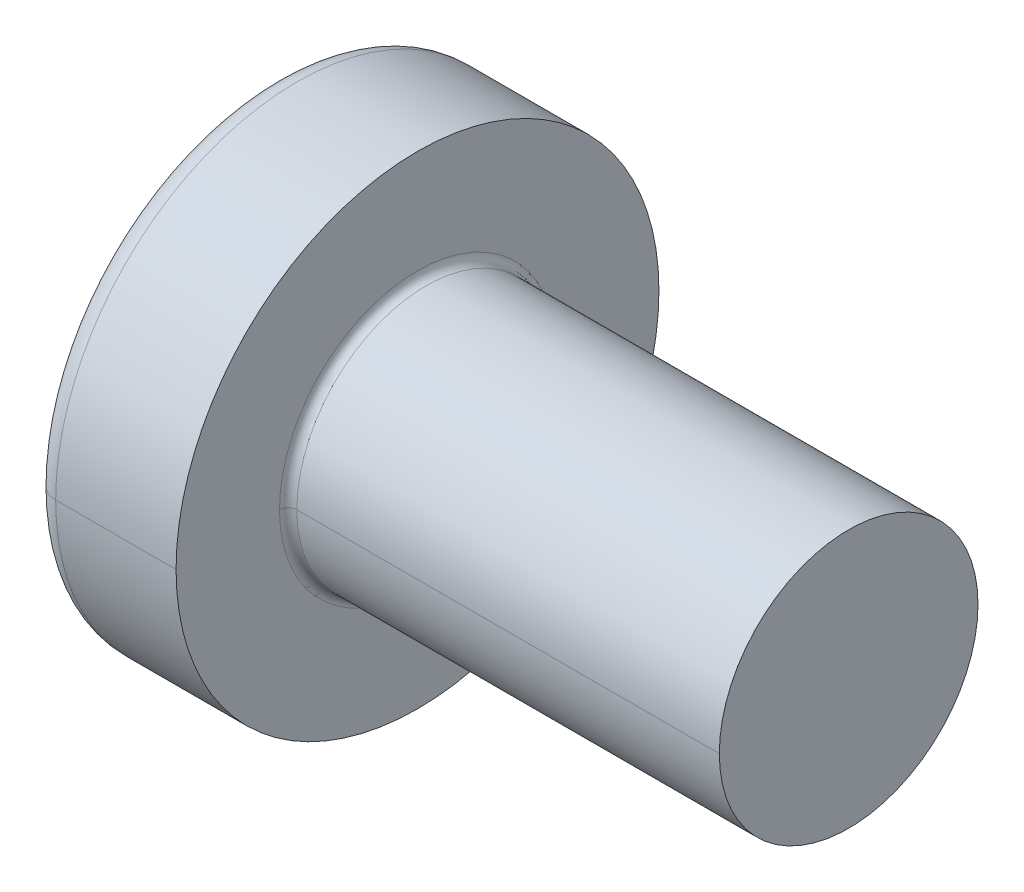
ISO-10303-21;
HEADER;
FILE_DESCRIPTION(('STEP AP214'),'2;1');
FILE_NAME('part.step','',(''),(''),'','','');
FILE_SCHEMA(('AUTOMOTIVE_DESIGN { 1 0 10303 214 1 1 1 1 }'));
ENDSEC;
DATA;
#1=APPLICATION_CONTEXT('core data for automotive mechanical design processes');
#2=APPLICATION_PROTOCOL_DEFINITION('international standard','automotive_design',2000,#1);
#3=PRODUCT_CONTEXT('',#1,'mechanical');
#4=PRODUCT('Part','Part','',(#3));
#5=PRODUCT_RELATED_PRODUCT_CATEGORY('part','',(#4));
#6=PRODUCT_DEFINITION_FORMATION('','',#4);
#7=PRODUCT_DEFINITION_CONTEXT('part definition',#1,'design');
#8=PRODUCT_DEFINITION('design','',#6,#7);
#9=PRODUCT_DEFINITION_SHAPE('','',#8);
#10=(LENGTH_UNIT() NAMED_UNIT(*) SI_UNIT(.MILLI.,.METRE.));
#11=(NAMED_UNIT(*) PLANE_ANGLE_UNIT() SI_UNIT($,.RADIAN.));
#12=(NAMED_UNIT(*) SI_UNIT($,.STERADIAN.) SOLID_ANGLE_UNIT());
#13=UNCERTAINTY_MEASURE_WITH_UNIT(LENGTH_MEASURE(1.E-05),#10,'distance_accuracy_value','');
#14=(GEOMETRIC_REPRESENTATION_CONTEXT(3) GLOBAL_UNCERTAINTY_ASSIGNED_CONTEXT((#13)) GLOBAL_UNIT_ASSIGNED_CONTEXT((#10,
#11,#12)) REPRESENTATION_CONTEXT('',''));
#15=CARTESIAN_POINT('',(0.,0.,0.));
#16=DIRECTION('',(0.,0.,1.));
#17=DIRECTION('',(1.,0.,0.));
#18=AXIS2_PLACEMENT_3D('',#15,#16,#17);
#19=CARTESIAN_POINT('',(1.75,0.,0.));
#20=DIRECTION('',(-1.,0.,0.));
#21=DIRECTION('',(0.,0.,1.));
#22=AXIS2_PLACEMENT_3D('',#19,#20,#21);
#23=CONICAL_SURFACE('',#22,0.556,0.0698131700797659);
#24=CARTESIAN_POINT('',(1.75,0.,0.));
#25=DIRECTION('',(-1.,0.,0.));
#26=DIRECTION('',(0.,0.,1.));
#27=AXIS2_PLACEMENT_3D('',#24,#25,#26);
#28=CIRCLE('',#27,0.556);
#29=CARTESIAN_POINT('',(1.75,0.37,0.415013252800521));
#30=VERTEX_POINT('',#29);
#31=CARTESIAN_POINT('',(1.75,0.415013252800438,0.37));
#32=VERTEX_POINT('',#31);
#33=EDGE_CURVE('E10',#30,#32,#28,.T.);
#34=ORIENTED_EDGE('',*,*,#33,.F.);
#35=CARTESIAN_POINT('',(0.0457951200896677,0.37,0.564760133041023));
#36=CARTESIAN_POINT('',(0.459714414560984,0.37,0.530157570950188));
#37=CARTESIAN_POINT('',(0.873562310752198,0.37,0.49466157398725));
#38=CARTESIAN_POINT('',(1.28725569682869,0.37,0.457455365426694));
#39=CARTESIAN_POINT('',(1.44152855585135,0.37,0.443580577090172));
#40=CARTESIAN_POINT('',(1.59577973725595,0.37,0.429460928792312));
#41=CARTESIAN_POINT('',(1.75,0.37,0.415013252800521));
#42=(BOUNDED_CURVE() B_SPLINE_CURVE(3,(#35,#36,#37,#38,#39,#40,#41),.UNSPECIFIED.,.F.,
.F.) B_SPLINE_CURVE_WITH_KNOTS((4,3,4),(1.86293707071727E-05,0.00126471872304593,
0.00172940316053664),
.UNSPECIFIED.) CURVE() GEOMETRIC_REPRESENTATION_ITEM() RATIONAL_B_SPLINE_CURVE((1.,1.,1.,1.,1.,
1.,1.)) REPRESENTATION_ITEM(''));
#43=CARTESIAN_POINT('',(0.0457951200896677,0.37,0.564760133041023));
#44=VERTEX_POINT('',#43);
#45=EDGE_CURVE('E239',#44,#30,#42,.T.);
#46=ORIENTED_EDGE('',*,*,#45,.F.);
#47=CARTESIAN_POINT('',(0.0457951200896418,0.,0.));
#48=DIRECTION('',(-1.,0.,0.));
#49=DIRECTION('',(0.,0.,-1.));
#50=AXIS2_PLACEMENT_3D('',#47,#48,#49);
#51=CIRCLE('',#50,0.675169614150692);
#52=CARTESIAN_POINT('',(0.0457951200896418,0.564760133040919,0.37));
#53=VERTEX_POINT('',#52);
#54=EDGE_CURVE('E253',#44,#53,#51,.T.);
#55=ORIENTED_EDGE('',*,*,#54,.T.);
#56=CARTESIAN_POINT('',(1.75,0.415013252800438,0.37));
#57=CARTESIAN_POINT('',(1.40508694476549,0.447325427470155,0.37));
#58=CARTESIAN_POINT('',(1.0600236419778,0.478042432000918,0.37));
#59=CARTESIAN_POINT('',(0.714889566385186,0.507901470296219,0.37));
#60=CARTESIAN_POINT('',(0.491887238581318,0.52719436403441,0.37));
#61=CARTESIAN_POINT('',(0.26885238485919,0.546113133596702,0.37));
#62=CARTESIAN_POINT('',(0.0457951200896418,0.564760133040919,0.37));
#63=(BOUNDED_CURVE() B_SPLINE_CURVE(3,(#56,#57,#58,#59,#60,#61,#62),.UNSPECIFIED.,.F.,
.F.) B_SPLINE_CURVE_WITH_KNOTS((4,3,4),(2.00874196653278E-07,0.00103947072881919,
0.00171097409518755),
.UNSPECIFIED.) CURVE() GEOMETRIC_REPRESENTATION_ITEM() RATIONAL_B_SPLINE_CURVE((1.,1.,1.,1.,1.,
1.,1.)) REPRESENTATION_ITEM(''));
#64=EDGE_CURVE('E267',#32,#53,#63,.T.);
#65=ORIENTED_EDGE('',*,*,#64,.F.);
#66=EDGE_LOOP('',(#34,#46,#55,#65));
#67=FACE_BOUND('',#66,.T.);
#68=ADVANCED_FACE('F15',(#67),#23,.F.);
#69=CARTESIAN_POINT('',(-998.069344648894,0.,0.));
#70=DIRECTION('',(-1.,0.,0.));
#71=DIRECTION('',(0.,0.,1.));
#72=AXIS2_PLACEMENT_3D('',#69,#70,#71);
#73=CONICAL_SURFACE('',#72,3077.68353717532,1.25663706143592);
#74=DIRECTION('',(-0.309016994374942,0.,-0.951056516295155));
#75=VECTOR('',#74,1.);
#76=CARTESIAN_POINT('',(1.93065535110549,0.,0.));
#77=LINE('',#76,#75);
#78=CARTESIAN_POINT('',(1.93065535110549,0.,0.));
#79=VERTEX_POINT('',#78);
#80=CARTESIAN_POINT('',(1.75,0.,-0.556));
#81=VERTEX_POINT('',#80);
#82=EDGE_CURVE('E390',#79,#81,#77,.T.);
#83=ORIENTED_EDGE('',*,*,#82,.F.);
#84=DIRECTION('',(-0.309016994374942,0.,0.951056516295155));
#85=VECTOR('',#84,1.);
#86=CARTESIAN_POINT('',(1.93065535110549,0.,0.));
#87=LINE('',#86,#85);
#88=CARTESIAN_POINT('',(1.75,0.,0.556));
#89=VERTEX_POINT('',#88);
#90=EDGE_CURVE('E386',#79,#89,#87,.T.);
#91=ORIENTED_EDGE('',*,*,#90,.T.);
#92=CARTESIAN_POINT('',(1.75,0.,0.));
#93=DIRECTION('',(-1.,0.,0.));
#94=DIRECTION('',(0.,0.,1.));
#95=AXIS2_PLACEMENT_3D('',#92,#93,#94);
#96=CIRCLE('',#95,0.556);
#97=EDGE_CURVE('E426',#89,#30,#96,.T.);
#98=ORIENTED_EDGE('',*,*,#97,.T.);
#99=ORIENTED_EDGE('',*,*,#33,.T.);
#100=CARTESIAN_POINT('',(1.75,0.,0.));
#101=DIRECTION('',(-1.,0.,0.));
#102=DIRECTION('',(0.,0.,1.));
#103=AXIS2_PLACEMENT_3D('',#100,#101,#102);
#104=CIRCLE('',#103,0.556);
#105=CARTESIAN_POINT('',(1.75,0.415013252800438,-0.37));
#106=VERTEX_POINT('',#105);
#107=EDGE_CURVE('E273',#32,#106,#104,.T.);
#108=ORIENTED_EDGE('',*,*,#107,.T.);
#109=CARTESIAN_POINT('',(1.75,0.,0.));
#110=DIRECTION('',(-1.,0.,0.));
#111=DIRECTION('',(0.,0.,1.));
#112=AXIS2_PLACEMENT_3D('',#109,#110,#111);
#113=CIRCLE('',#112,0.556);
#114=CARTESIAN_POINT('',(1.75,0.37,-0.415013252800436));
#115=VERTEX_POINT('',#114);
#116=EDGE_CURVE('E25',#106,#115,#113,.T.);
#117=ORIENTED_EDGE('',*,*,#116,.T.);
#118=CARTESIAN_POINT('',(1.75,0.,0.));
#119=DIRECTION('',(-1.,0.,0.));
#120=DIRECTION('',(0.,0.,1.));
#121=AXIS2_PLACEMENT_3D('',#118,#119,#120);
#122=CIRCLE('',#121,0.556);
#123=EDGE_CURVE('E343',#115,#81,#122,.T.);
#124=ORIENTED_EDGE('',*,*,#123,.T.);
#125=EDGE_LOOP('',(#83,#91,#98,#99,#108,#117,#124));
#126=FACE_BOUND('',#125,.T.);
#127=ADVANCED_FACE('F473',(#126),#73,.F.);
#128=CARTESIAN_POINT('',(1.75,0.,0.));
#129=DIRECTION('',(-1.,0.,0.));
#130=DIRECTION('',(0.,0.,1.));
#131=AXIS2_PLACEMENT_3D('',#128,#129,#130);
#132=CONICAL_SURFACE('',#131,0.556,0.0698131700797659);
#133=CARTESIAN_POINT('',(0.0457951200896418,0.,0.));
#134=DIRECTION('',(-1.,0.,0.));
#135=DIRECTION('',(0.,0.,-1.));
#136=AXIS2_PLACEMENT_3D('',#133,#134,#135);
#137=CIRCLE('',#136,0.675169614150692);
#138=CARTESIAN_POINT('',(0.0457951200896418,-0.564760133040919,0.37));
#139=VERTEX_POINT('',#138);
#140=CARTESIAN_POINT('',(0.0457951200896677,-0.37,0.56476013304102));
#141=VERTEX_POINT('',#140);
#142=EDGE_CURVE('E362',#139,#141,#137,.T.);
#143=ORIENTED_EDGE('',*,*,#142,.T.);
#144=CARTESIAN_POINT('',(1.75,-0.37,0.415013252800436));
#145=CARTESIAN_POINT('',(1.40508694476549,-0.37,0.447325427470153));
#146=CARTESIAN_POINT('',(1.0600236419778,-0.37,0.478042432000917));
#147=CARTESIAN_POINT('',(0.714889566385186,-0.37,0.507901470296218));
#148=CARTESIAN_POINT('',(0.491887238581318,-0.37,0.527194364034409));
#149=CARTESIAN_POINT('',(0.26885238485919,-0.37,0.546113133596701));
#150=CARTESIAN_POINT('',(0.0457951200896677,-0.37,0.56476013304102));
#151=(BOUNDED_CURVE() B_SPLINE_CURVE(3,(#144,#145,#146,#147,#148,#149,#150),.UNSPECIFIED.,.F.,
.F.) B_SPLINE_CURVE_WITH_KNOTS((4,3,4),(2.00874196653249E-07,0.00103947072881919,
0.00171097409518755),
.UNSPECIFIED.) CURVE() GEOMETRIC_REPRESENTATION_ITEM() RATIONAL_B_SPLINE_CURVE((1.,1.,1.,1.,1.,
1.,1.)) REPRESENTATION_ITEM(''));
#152=CARTESIAN_POINT('',(1.75,-0.37,0.415013252800436));
#153=VERTEX_POINT('',#152);
#154=EDGE_CURVE('E297',#153,#141,#151,.T.);
#155=ORIENTED_EDGE('',*,*,#154,.F.);
#156=CARTESIAN_POINT('',(1.75,0.,0.));
#157=DIRECTION('',(-1.,0.,0.));
#158=DIRECTION('',(0.,0.,1.));
#159=AXIS2_PLACEMENT_3D('',#156,#157,#158);
#160=CIRCLE('',#159,0.556);
#161=CARTESIAN_POINT('',(1.75,-0.415013252800438,0.37));
#162=VERTEX_POINT('',#161);
#163=EDGE_CURVE('E335',#162,#153,#160,.T.);
#164=ORIENTED_EDGE('',*,*,#163,.F.);
#165=CARTESIAN_POINT('',(0.0457951200896418,-0.564760133040919,0.37));
#166=CARTESIAN_POINT('',(0.459714414560985,-0.530157570950187,0.37));
#167=CARTESIAN_POINT('',(0.873562310752198,-0.494661573987248,0.37));
#168=CARTESIAN_POINT('',(1.28725569682869,-0.457455365426693,0.37));
#169=CARTESIAN_POINT('',(1.44152855585135,-0.443580577090171,0.37));
#170=CARTESIAN_POINT('',(1.59577973725595,-0.429460928792311,0.37));
#171=CARTESIAN_POINT('',(1.75,-0.415013252800438,0.37));
#172=(BOUNDED_CURVE() B_SPLINE_CURVE(3,(#165,#166,#167,#168,#169,#170,#171),.UNSPECIFIED.,.F.,
.F.) B_SPLINE_CURVE_WITH_KNOTS((4,3,4),(1.86293707071732E-05,0.00126471872304593,
0.00172940316053664),
.UNSPECIFIED.) CURVE() GEOMETRIC_REPRESENTATION_ITEM() RATIONAL_B_SPLINE_CURVE((1.,1.,1.,1.,1.,
1.,1.)) REPRESENTATION_ITEM(''));
#173=EDGE_CURVE('E417',#139,#162,#172,.T.);
#174=ORIENTED_EDGE('',*,*,#173,.F.);
#175=EDGE_LOOP('',(#143,#155,#164,#174));
#176=FACE_BOUND('',#175,.T.);
#177=ADVANCED_FACE('F856',(#176),#132,.F.);
#178=CARTESIAN_POINT('',(1.75,0.,0.));
#179=DIRECTION('',(-1.,0.,0.));
#180=DIRECTION('',(0.,0.,1.));
#181=AXIS2_PLACEMENT_3D('',#178,#179,#180);
#182=CONICAL_SURFACE('',#181,0.556,0.0698131700797659);
#183=CARTESIAN_POINT('',(0.0457951200896418,0.,0.));
#184=DIRECTION('',(-1.,0.,0.));
#185=DIRECTION('',(0.,0.,-1.));
#186=AXIS2_PLACEMENT_3D('',#183,#184,#185);
#187=CIRCLE('',#186,0.675169614150692);
#188=CARTESIAN_POINT('',(0.0457951200896418,0.564760133040919,-0.37));
#189=VERTEX_POINT('',#188);
#190=CARTESIAN_POINT('',(0.0457951200896677,0.37,-0.564760133041021));
#191=VERTEX_POINT('',#190);
#192=EDGE_CURVE('E320',#189,#191,#187,.T.);
#193=ORIENTED_EDGE('',*,*,#192,.T.);
#194=CARTESIAN_POINT('',(1.75,0.37,-0.415013252800436));
#195=CARTESIAN_POINT('',(1.40508694476549,0.37,-0.447325427470153));
#196=CARTESIAN_POINT('',(1.0600236419778,0.37,-0.478042432000917));
#197=CARTESIAN_POINT('',(0.714889566385186,0.37,-0.507901470296218));
#198=CARTESIAN_POINT('',(0.491887238581318,0.37,-0.527194364034409));
#199=CARTESIAN_POINT('',(0.26885238485919,0.37,-0.546113133596701));
#200=CARTESIAN_POINT('',(0.0457951200896677,0.37,-0.564760133041021));
#201=(BOUNDED_CURVE() B_SPLINE_CURVE(3,(#194,#195,#196,#197,#198,#199,#200),.UNSPECIFIED.,.F.,
.F.) B_SPLINE_CURVE_WITH_KNOTS((4,3,4),(2.00874196653293E-07,0.00103947072881919,
0.00171097409518755),
.UNSPECIFIED.) CURVE() GEOMETRIC_REPRESENTATION_ITEM() RATIONAL_B_SPLINE_CURVE((1.,1.,1.,1.,1.,
1.,1.)) REPRESENTATION_ITEM(''));
#202=EDGE_CURVE('E367',#115,#191,#201,.T.);
#203=ORIENTED_EDGE('',*,*,#202,.F.);
#204=ORIENTED_EDGE('',*,*,#116,.F.);
#205=CARTESIAN_POINT('',(0.0457951200896418,0.564760133040919,-0.37));
#206=CARTESIAN_POINT('',(0.459714414560985,0.530157570950187,-0.37));
#207=CARTESIAN_POINT('',(0.873562310752198,0.494661573987248,-0.37));
#208=CARTESIAN_POINT('',(1.28725569682869,0.457455365426693,-0.37));
#209=CARTESIAN_POINT('',(1.44152855585135,0.443580577090172,-0.37));
#210=CARTESIAN_POINT('',(1.59577973725595,0.429460928792311,-0.37));
#211=CARTESIAN_POINT('',(1.75,0.415013252800438,-0.37));
#212=(BOUNDED_CURVE() B_SPLINE_CURVE(3,(#205,#206,#207,#208,#209,#210,#211),.UNSPECIFIED.,.F.,
.F.) B_SPLINE_CURVE_WITH_KNOTS((4,3,4),(1.86293707071732E-05,0.00126471872304593,
0.00172940316053664),
.UNSPECIFIED.) CURVE() GEOMETRIC_REPRESENTATION_ITEM() RATIONAL_B_SPLINE_CURVE((1.,1.,1.,1.,1.,
1.,1.)) REPRESENTATION_ITEM(''));
#213=EDGE_CURVE('E292',#189,#106,#212,.T.);
#214=ORIENTED_EDGE('',*,*,#213,.F.);
#215=EDGE_LOOP('',(#193,#203,#204,#214));
#216=FACE_BOUND('',#215,.T.);
#217=ADVANCED_FACE('F860',(#216),#182,.F.);
#218=CARTESIAN_POINT('',(1.75,0.,0.));
#219=DIRECTION('',(-1.,0.,0.));
#220=DIRECTION('',(0.,0.,1.));
#221=AXIS2_PLACEMENT_3D('',#218,#219,#220);
#222=CONICAL_SURFACE('',#221,0.556,0.0698131700797659);
#223=CARTESIAN_POINT('',(1.75,0.,0.));
#224=DIRECTION('',(-1.,0.,0.));
#225=DIRECTION('',(0.,0.,1.));
#226=AXIS2_PLACEMENT_3D('',#223,#224,#225);
#227=CIRCLE('',#226,0.556);
#228=CARTESIAN_POINT('',(1.75,-0.37,-0.415013252800439));
#229=VERTEX_POINT('',#228);
#230=CARTESIAN_POINT('',(1.75,-0.415013252800438,-0.37));
#231=VERTEX_POINT('',#230);
#232=EDGE_CURVE('E281',#229,#231,#227,.T.);
#233=ORIENTED_EDGE('',*,*,#232,.F.);
#234=CARTESIAN_POINT('',(0.0457951200896677,-0.37,-0.564760133041023));
#235=CARTESIAN_POINT('',(0.459714414560984,-0.37,-0.530157570950188));
#236=CARTESIAN_POINT('',(0.873562310752198,-0.37,-0.494661573987249));
#237=CARTESIAN_POINT('',(1.28725569682869,-0.37,-0.457455365426694));
#238=CARTESIAN_POINT('',(1.44152855585135,-0.37,-0.443580577090172));
#239=CARTESIAN_POINT('',(1.59577973725595,-0.37,-0.429460928792312));
#240=CARTESIAN_POINT('',(1.75,-0.37,-0.415013252800439));
#241=(BOUNDED_CURVE() B_SPLINE_CURVE(3,(#234,#235,#236,#237,#238,#239,#240),.UNSPECIFIED.,.F.,
.F.) B_SPLINE_CURVE_WITH_KNOTS((4,3,4),(1.86293707071727E-05,0.00126471872304593,
0.00172940316053664),
.UNSPECIFIED.) CURVE() GEOMETRIC_REPRESENTATION_ITEM() RATIONAL_B_SPLINE_CURVE((1.,1.,1.,1.,1.,
1.,1.)) REPRESENTATION_ITEM(''));
#242=CARTESIAN_POINT('',(0.0457951200896677,-0.37,-0.564760133041023));
#243=VERTEX_POINT('',#242);
#244=EDGE_CURVE('E488',#243,#229,#241,.T.);
#245=ORIENTED_EDGE('',*,*,#244,.F.);
#246=CARTESIAN_POINT('',(0.0457951200896418,0.,0.));
#247=DIRECTION('',(-1.,0.,0.));
#248=DIRECTION('',(0.,0.,-1.));
#249=AXIS2_PLACEMENT_3D('',#246,#247,#248);
#250=CIRCLE('',#249,0.675169614150692);
#251=CARTESIAN_POINT('',(0.0457951200896418,-0.564760133040919,-0.37));
#252=VERTEX_POINT('',#251);
#253=EDGE_CURVE('E412',#243,#252,#250,.T.);
#254=ORIENTED_EDGE('',*,*,#253,.T.);
#255=CARTESIAN_POINT('',(1.75,-0.415013252800438,-0.37));
#256=CARTESIAN_POINT('',(1.40508694476549,-0.447325427470155,-0.37));
#257=CARTESIAN_POINT('',(1.0600236419778,-0.478042432000918,-0.37));
#258=CARTESIAN_POINT('',(0.714889566385186,-0.507901470296219,-0.37));
#259=CARTESIAN_POINT('',(0.491887238581318,-0.52719436403441,-0.37));
#260=CARTESIAN_POINT('',(0.268852384859189,-0.546113133596703,-0.37));
#261=CARTESIAN_POINT('',(0.0457951200896418,-0.564760133040919,-0.37));
#262=(BOUNDED_CURVE() B_SPLINE_CURVE(3,(#255,#256,#257,#258,#259,#260,#261),.UNSPECIFIED.,.F.,
.F.) B_SPLINE_CURVE_WITH_KNOTS((4,3,4),(2.00874196653278E-07,0.00103947072881919,
0.00171097409518755),
.UNSPECIFIED.) CURVE() GEOMETRIC_REPRESENTATION_ITEM() RATIONAL_B_SPLINE_CURVE((1.,1.,1.,1.,1.,
1.,1.)) REPRESENTATION_ITEM(''));
#263=EDGE_CURVE('E490',#231,#252,#262,.T.);
#264=ORIENTED_EDGE('',*,*,#263,.F.);
#265=EDGE_LOOP('',(#233,#245,#254,#264));
#266=FACE_BOUND('',#265,.T.);
#267=ADVANCED_FACE('F487',(#266),#222,.F.);
#268=CARTESIAN_POINT('',(1.75,-0.37,0.602));
#269=DIRECTION('',(-0.414899470250718,0.,-0.90986725932175));
#270=DIRECTION('',(-0.90986725932175,0.,0.414899470250718));
#271=AXIS2_PLACEMENT_3D('',#268,#269,#270);
#272=PLANE('',#271);
#273=CARTESIAN_POINT('',(4.66779696937586,0.,-0.728515418035393));
#274=DIRECTION('',(-0.414899470250718,0.,-0.90986725932175));
#275=DIRECTION('',(-0.90986725932175,0.,0.414899470250718));
#276=AXIS2_PLACEMENT_3D('',#273,#274,#275);
#277=CIRCLE('',#276,4.93547428644187);
#278=CARTESIAN_POINT('',(0.18980721879399,-0.370000000000005,1.31344790822994));
#279=VERTEX_POINT('',#278);
#280=CARTESIAN_POINT('',(0.189807218793991,0.369999999999995,1.31344790822994));
#281=VERTEX_POINT('',#280);
#282=EDGE_CURVE('E242',#279,#281,#277,.T.);
#283=ORIENTED_EDGE('',*,*,#282,.T.);
#284=DIRECTION('',(0.90986725932175,0.,-0.414899470250718));
#285=VECTOR('',#284,1.);
#286=CARTESIAN_POINT('',(0.,0.369999999999995,1.4));
#287=LINE('',#286,#285);
#288=CARTESIAN_POINT('',(1.75,0.37,0.602));
#289=VERTEX_POINT('',#288);
#290=EDGE_CURVE('E226',#281,#289,#287,.T.);
#291=ORIENTED_EDGE('',*,*,#290,.T.);
#292=DIRECTION('',(0.,-1.,0.));
#293=VECTOR('',#292,1.);
#294=CARTESIAN_POINT('',(1.75,-0.37,0.602));
#295=LINE('',#294,#293);
#296=CARTESIAN_POINT('',(1.75,-0.37,0.602));
#297=VERTEX_POINT('',#296);
#298=EDGE_CURVE('E425',#289,#297,#295,.T.);
#299=ORIENTED_EDGE('',*,*,#298,.T.);
#300=DIRECTION('',(0.90986725932175,0.,-0.414899470250718));
#301=VECTOR('',#300,1.);
#302=CARTESIAN_POINT('',(0.,-0.370000000000005,1.4));
#303=LINE('',#302,#301);
#304=EDGE_CURVE('E40',#279,#297,#303,.T.);
#305=ORIENTED_EDGE('',*,*,#304,.F.);
#306=EDGE_LOOP('',(#283,#291,#299,#305));
#307=FACE_BOUND('',#306,.T.);
#308=ADVANCED_FACE('F243',(#307),#272,.T.);
#309=CARTESIAN_POINT('',(1.75,0.37,-0.602));
#310=DIRECTION('',(-0.414899470250718,0.,0.90986725932175));
#311=DIRECTION('',(0.,1.,0.));
#312=AXIS2_PLACEMENT_3D('',#309,#310,#311);
#313=PLANE('',#312);
#314=CARTESIAN_POINT('',(4.66779696937586,0.,0.728515418035393));
#315=DIRECTION('',(-0.414899470250718,0.,0.90986725932175));
#316=DIRECTION('',(0.90986725932175,0.,0.414899470250718));
#317=AXIS2_PLACEMENT_3D('',#314,#315,#316);
#318=CIRCLE('',#317,4.93547428644187);
#319=CARTESIAN_POINT('',(0.189807218793991,0.370000000000005,-1.31344790822994));
#320=VERTEX_POINT('',#319);
#321=CARTESIAN_POINT('',(0.189807218793991,-0.369999999999995,-1.31344790822994));
#322=VERTEX_POINT('',#321);
#323=EDGE_CURVE('E321',#320,#322,#318,.T.);
#324=ORIENTED_EDGE('',*,*,#323,.T.);
#325=DIRECTION('',(0.90986725932175,0.,0.414899470250718));
#326=VECTOR('',#325,1.);
#327=CARTESIAN_POINT('',(0.,-0.369999999999995,-1.4));
#328=LINE('',#327,#326);
#329=CARTESIAN_POINT('',(1.75,-0.37,-0.602));
#330=VERTEX_POINT('',#329);
#331=EDGE_CURVE('E372',#322,#330,#328,.T.);
#332=ORIENTED_EDGE('',*,*,#331,.T.);
#333=DIRECTION('',(0.,1.,0.));
#334=VECTOR('',#333,1.);
#335=CARTESIAN_POINT('',(1.75,-0.37,-0.602));
#336=LINE('',#335,#334);
#337=CARTESIAN_POINT('',(1.75,0.37,-0.602));
#338=VERTEX_POINT('',#337);
#339=EDGE_CURVE('E18',#330,#338,#336,.T.);
#340=ORIENTED_EDGE('',*,*,#339,.T.);
#341=DIRECTION('',(0.90986725932175,0.,0.414899470250718));
#342=VECTOR('',#341,1.);
#343=CARTESIAN_POINT('',(0.,0.370000000000005,-1.4));
#344=LINE('',#343,#342);
#345=EDGE_CURVE('E302',#320,#338,#344,.T.);
#346=ORIENTED_EDGE('',*,*,#345,.F.);
#347=EDGE_LOOP('',(#324,#332,#340,#346));
#348=FACE_BOUND('',#347,.T.);
#349=ADVANCED_FACE('F922',(#348),#313,.T.);
#350=CARTESIAN_POINT('',(1.75,0.602,0.37));
#351=DIRECTION('',(-0.414899470250718,-0.90986725932175,0.));
#352=DIRECTION('',(-0.90986725932175,0.414899470250718,0.));
#353=AXIS2_PLACEMENT_3D('',#350,#351,#352);
#354=PLANE('',#353);
#355=CARTESIAN_POINT('',(4.66779696937586,-0.728515418035393,0.));
#356=DIRECTION('',(-0.414899470250718,-0.90986725932175,0.));
#357=DIRECTION('',(0.90986725932175,-0.414899470250718,0.));
#358=AXIS2_PLACEMENT_3D('',#355,#356,#357);
#359=CIRCLE('',#358,4.93547428644187);
#360=CARTESIAN_POINT('',(0.18980721879399,1.31344790822994,0.37));
#361=VERTEX_POINT('',#360);
#362=CARTESIAN_POINT('',(0.177170506918026,1.31921024884538,0.));
#363=VERTEX_POINT('',#362);
#364=EDGE_CURVE('E347',#361,#363,#359,.T.);
#365=ORIENTED_EDGE('',*,*,#364,.T.);
#366=CARTESIAN_POINT('',(4.66779696937586,-0.728515418035393,0.));
#367=DIRECTION('',(-0.414899470250718,-0.90986725932175,0.));
#368=DIRECTION('',(0.90986725932175,-0.414899470250718,0.));
#369=AXIS2_PLACEMENT_3D('',#366,#367,#368);
#370=CIRCLE('',#369,4.93547428644187);
#371=CARTESIAN_POINT('',(0.189807218793991,1.31344790822994,-0.37));
#372=VERTEX_POINT('',#371);
#373=EDGE_CURVE('E265',#363,#372,#370,.T.);
#374=ORIENTED_EDGE('',*,*,#373,.T.);
#375=DIRECTION('',(0.90986725932175,-0.414899470250718,0.));
#376=VECTOR('',#375,1.);
#377=CARTESIAN_POINT('',(0.,1.4,-0.37));
#378=LINE('',#377,#376);
#379=CARTESIAN_POINT('',(1.75,0.602,-0.37));
#380=VERTEX_POINT('',#379);
#381=EDGE_CURVE('E291',#372,#380,#378,.T.);
#382=ORIENTED_EDGE('',*,*,#381,.T.);
#383=DIRECTION('',(0.,0.,1.));
#384=VECTOR('',#383,1.);
#385=CARTESIAN_POINT('',(1.75,0.602,0.37));
#386=LINE('',#385,#384);
#387=CARTESIAN_POINT('',(1.75,0.602,0.37));
#388=VERTEX_POINT('',#387);
#389=EDGE_CURVE('E280',#380,#388,#386,.T.);
#390=ORIENTED_EDGE('',*,*,#389,.T.);
#391=DIRECTION('',(0.90986725932175,-0.414899470250718,0.));
#392=VECTOR('',#391,1.);
#393=CARTESIAN_POINT('',(0.,1.4,0.37));
#394=LINE('',#393,#392);
#395=EDGE_CURVE('E271',#361,#388,#394,.T.);
#396=ORIENTED_EDGE('',*,*,#395,.F.);
#397=EDGE_LOOP('',(#365,#374,#382,#390,#396));
#398=FACE_BOUND('',#397,.T.);
#399=ADVANCED_FACE('F642',(#398),#354,.T.);
#400=CARTESIAN_POINT('',(1.75,-0.602,-0.37));
#401=DIRECTION('',(-0.414899470250718,0.90986725932175,0.));
#402=DIRECTION('',(0.,0.,1.));
#403=AXIS2_PLACEMENT_3D('',#400,#401,#402);
#404=PLANE('',#403);
#405=CARTESIAN_POINT('',(4.66779696937586,0.728515418035392,0.));
#406=DIRECTION('',(-0.414899470250718,0.90986725932175,0.));
#407=DIRECTION('',(-0.90986725932175,-0.414899470250718,0.));
#408=AXIS2_PLACEMENT_3D('',#405,#406,#407);
#409=CIRCLE('',#408,4.93547428644187);
#410=CARTESIAN_POINT('',(0.189807218793991,-1.31344790822994,-0.37));
#411=VERTEX_POINT('',#410);
#412=CARTESIAN_POINT('',(0.177170506918027,-1.31921024884538,0.));
#413=VERTEX_POINT('',#412);
#414=EDGE_CURVE('E309',#411,#413,#409,.T.);
#415=ORIENTED_EDGE('',*,*,#414,.T.);
#416=CARTESIAN_POINT('',(4.66779696937586,0.728515418035392,0.));
#417=DIRECTION('',(-0.414899470250718,0.90986725932175,0.));
#418=DIRECTION('',(-0.90986725932175,-0.414899470250718,0.));
#419=AXIS2_PLACEMENT_3D('',#416,#417,#418);
#420=CIRCLE('',#419,4.93547428644187);
#421=CARTESIAN_POINT('',(0.189807218793991,-1.31344790822994,0.37));
#422=VERTEX_POINT('',#421);
#423=EDGE_CURVE('E546',#413,#422,#420,.T.);
#424=ORIENTED_EDGE('',*,*,#423,.T.);
#425=DIRECTION('',(0.90986725932175,0.414899470250718,0.));
#426=VECTOR('',#425,1.);
#427=CARTESIAN_POINT('',(0.,-1.4,0.37));
#428=LINE('',#427,#426);
#429=CARTESIAN_POINT('',(1.75,-0.602,0.37));
#430=VERTEX_POINT('',#429);
#431=EDGE_CURVE('E315',#422,#430,#428,.T.);
#432=ORIENTED_EDGE('',*,*,#431,.T.);
#433=DIRECTION('',(0.,0.,-1.));
#434=VECTOR('',#433,1.);
#435=CARTESIAN_POINT('',(1.75,-0.602,0.37));
#436=LINE('',#435,#434);
#437=CARTESIAN_POINT('',(1.75,-0.602,-0.37));
#438=VERTEX_POINT('',#437);
#439=EDGE_CURVE('E296',#430,#438,#436,.T.);
#440=ORIENTED_EDGE('',*,*,#439,.T.);
#441=DIRECTION('',(0.90986725932175,0.414899470250718,0.));
#442=VECTOR('',#441,1.);
#443=CARTESIAN_POINT('',(0.,-1.4,-0.37));
#444=LINE('',#443,#442);
#445=EDGE_CURVE('E558',#411,#438,#444,.T.);
#446=ORIENTED_EDGE('',*,*,#445,.F.);
#447=EDGE_LOOP('',(#415,#424,#432,#440,#446));
#448=FACE_BOUND('',#447,.T.);
#449=ADVANCED_FACE('F1013',(#448),#404,.T.);
#450=CARTESIAN_POINT('',(2.5,0.,0.));
#451=DIRECTION('',(-1.,0.,0.));
#452=DIRECTION('',(0.,0.,1.));
#453=AXIS2_PLACEMENT_3D('',#450,#451,#452);
#454=TOROIDAL_SURFACE('',#453,1.6,0.1);
#455=CARTESIAN_POINT('',(2.5,0.,-1.6));
#456=DIRECTION('',(0.,1.,0.));
#457=DIRECTION('',(0.,0.,1.));
#458=AXIS2_PLACEMENT_3D('',#455,#456,#457);
#459=CIRCLE('',#458,0.1);
#460=CARTESIAN_POINT('',(2.4,0.,-1.6));
#461=VERTEX_POINT('',#460);
#462=CARTESIAN_POINT('',(2.5,0.,-1.5));
#463=VERTEX_POINT('',#462);
#464=EDGE_CURVE('E361',#461,#463,#459,.T.);
#465=ORIENTED_EDGE('',*,*,#464,.F.);
#466=CARTESIAN_POINT('',(2.4,0.,0.));
#467=DIRECTION('',(-1.,0.,0.));
#468=DIRECTION('',(0.,0.,1.));
#469=AXIS2_PLACEMENT_3D('',#466,#467,#468);
#470=CIRCLE('',#469,1.6);
#471=CARTESIAN_POINT('',(2.4,0.,1.6));
#472=VERTEX_POINT('',#471);
#473=EDGE_CURVE('E379',#472,#461,#470,.T.);
#474=ORIENTED_EDGE('',*,*,#473,.F.);
#475=CARTESIAN_POINT('',(2.5,0.,1.6));
#476=DIRECTION('',(0.,-1.,0.));
#477=DIRECTION('',(0.,0.,-1.));
#478=AXIS2_PLACEMENT_3D('',#475,#476,#477);
#479=CIRCLE('',#478,0.1);
#480=CARTESIAN_POINT('',(2.5,0.,1.5));
#481=VERTEX_POINT('',#480);
#482=EDGE_CURVE('E380',#472,#481,#479,.T.);
#483=ORIENTED_EDGE('',*,*,#482,.T.);
#484=CARTESIAN_POINT('',(2.5,0.,0.));
#485=DIRECTION('',(1.,0.,0.));
#486=DIRECTION('',(0.,0.,1.));
#487=AXIS2_PLACEMENT_3D('',#484,#485,#486);
#488=CIRCLE('',#487,1.5);
#489=EDGE_CURVE('E569',#463,#481,#488,.T.);
#490=ORIENTED_EDGE('',*,*,#489,.F.);
#491=EDGE_LOOP('',(#465,#474,#483,#490));
#492=FACE_BOUND('',#491,.T.);
#493=ADVANCED_FACE('F989',(#492),#454,.F.);
#494=CARTESIAN_POINT('',(7.4,0.,0.));
#495=DIRECTION('',(-1.,0.,0.));
#496=DIRECTION('',(0.,0.,1.));
#497=AXIS2_PLACEMENT_3D('',#494,#495,#496);
#498=PLANE('',#497);
#499=CARTESIAN_POINT('',(7.4,0.,0.));
#500=DIRECTION('',(-1.,0.,0.));
#501=DIRECTION('',(0.,0.,1.));
#502=AXIS2_PLACEMENT_3D('',#499,#500,#501);
#503=CIRCLE('',#502,1.5);
#504=CARTESIAN_POINT('',(7.4,0.,1.5));
#505=VERTEX_POINT('',#504);
#506=CARTESIAN_POINT('',(7.4,0.,-1.5));
#507=VERTEX_POINT('',#506);
#508=EDGE_CURVE('E384',#505,#507,#503,.T.);
#509=ORIENTED_EDGE('',*,*,#508,.F.);
#510=CARTESIAN_POINT('',(7.4,0.,0.));
#511=DIRECTION('',(-1.,0.,0.));
#512=DIRECTION('',(0.,0.,1.));
#513=AXIS2_PLACEMENT_3D('',#510,#511,#512);
#514=CIRCLE('',#513,1.5);
#515=EDGE_CURVE('E593',#507,#505,#514,.T.);
#516=ORIENTED_EDGE('',*,*,#515,.F.);
#517=EDGE_LOOP('',(#509,#516));
#518=FACE_BOUND('',#517,.T.);
#519=ADVANCED_FACE('F963',(#518),#498,.F.);
#520=CARTESIAN_POINT('',(0.,0.,0.));
#521=DIRECTION('',(-1.,0.,0.));
#522=DIRECTION('',(0.,0.,1.));
#523=AXIS2_PLACEMENT_3D('',#520,#521,#522);
#524=CYLINDRICAL_SURFACE('',#523,1.5);
#525=DIRECTION('',(-1.,0.,0.));
#526=VECTOR('',#525,1.);
#527=CARTESIAN_POINT('',(0.,0.,-1.5));
#528=LINE('',#527,#526);
#529=EDGE_CURVE('E404',#507,#463,#528,.T.);
#530=ORIENTED_EDGE('',*,*,#529,.F.);
#531=ORIENTED_EDGE('',*,*,#515,.T.);
#532=DIRECTION('',(-1.,0.,0.));
#533=VECTOR('',#532,1.);
#534=CARTESIAN_POINT('',(0.,0.,1.5));
#535=LINE('',#534,#533);
#536=EDGE_CURVE('E455',#505,#481,#535,.T.);
#537=ORIENTED_EDGE('',*,*,#536,.T.);
#538=CARTESIAN_POINT('',(2.5,0.,0.));
#539=DIRECTION('',(1.,0.,0.));
#540=DIRECTION('',(0.,0.,1.));
#541=AXIS2_PLACEMENT_3D('',#538,#539,#540);
#542=CIRCLE('',#541,1.5);
#543=EDGE_CURVE('E385',#481,#463,#542,.T.);
#544=ORIENTED_EDGE('',*,*,#543,.T.);
#545=EDGE_LOOP('',(#530,#531,#537,#544));
#546=FACE_BOUND('',#545,.T.);
#547=ADVANCED_FACE('F884',(#546),#524,.T.);
#548=CARTESIAN_POINT('',(2.4,1.5,0.));
#549=DIRECTION('',(-1.,0.,0.));
#550=DIRECTION('',(0.,0.,1.));
#551=AXIS2_PLACEMENT_3D('',#548,#549,#550);
#552=PLANE('',#551);
#553=ORIENTED_EDGE('',*,*,#473,.T.);
#554=CARTESIAN_POINT('',(2.4,0.,0.));
#555=DIRECTION('',(-1.,0.,0.));
#556=DIRECTION('',(0.,0.,1.));
#557=AXIS2_PLACEMENT_3D('',#554,#555,#556);
#558=CIRCLE('',#557,1.6);
#559=EDGE_CURVE('E334',#461,#472,#558,.T.);
#560=ORIENTED_EDGE('',*,*,#559,.T.);
#561=EDGE_LOOP('',(#553,#560));
#562=FACE_BOUND('',#561,.T.);
#563=CARTESIAN_POINT('',(2.4,0.,0.));
#564=DIRECTION('',(-1.,0.,0.));
#565=DIRECTION('',(0.,0.,1.));
#566=AXIS2_PLACEMENT_3D('',#563,#564,#565);
#567=CIRCLE('',#566,2.8);
#568=CARTESIAN_POINT('',(2.4,0.,2.8));
#569=VERTEX_POINT('',#568);
#570=CARTESIAN_POINT('',(2.4,0.,-2.8));
#571=VERTEX_POINT('',#570);
#572=EDGE_CURVE('E450',#569,#571,#567,.T.);
#573=ORIENTED_EDGE('',*,*,#572,.F.);
#574=CARTESIAN_POINT('',(2.4,0.,0.));
#575=DIRECTION('',(-1.,0.,0.));
#576=DIRECTION('',(0.,0.,1.));
#577=AXIS2_PLACEMENT_3D('',#574,#575,#576);
#578=CIRCLE('',#577,2.8);
#579=EDGE_CURVE('E329',#571,#569,#578,.T.);
#580=ORIENTED_EDGE('',*,*,#579,.F.);
#581=EDGE_LOOP('',(#573,#580));
#582=FACE_BOUND('',#581,.T.);
#583=ADVANCED_FACE('F515',(#562,#582),#552,.F.);
#584=CARTESIAN_POINT('',(0.,0.,0.));
#585=DIRECTION('',(-1.,0.,0.));
#586=DIRECTION('',(0.,0.,1.));
#587=AXIS2_PLACEMENT_3D('',#584,#585,#586);
#588=CYLINDRICAL_SURFACE('',#587,2.8);
#589=DIRECTION('',(-1.,0.,0.));
#590=VECTOR('',#589,1.);
#591=CARTESIAN_POINT('',(0.,0.,-2.8));
#592=LINE('',#591,#590);
#593=CARTESIAN_POINT('',(1.00350153259131,0.,-2.8));
#594=VERTEX_POINT('',#593);
#595=EDGE_CURVE('E454',#571,#594,#592,.T.);
#596=ORIENTED_EDGE('',*,*,#595,.F.);
#597=ORIENTED_EDGE('',*,*,#579,.T.);
#598=DIRECTION('',(-1.,0.,0.));
#599=VECTOR('',#598,1.);
#600=CARTESIAN_POINT('',(0.,0.,2.8));
#601=LINE('',#600,#599);
#602=CARTESIAN_POINT('',(1.00350153259131,0.,2.8));
#603=VERTEX_POINT('',#602);
#604=EDGE_CURVE('E348',#569,#603,#601,.T.);
#605=ORIENTED_EDGE('',*,*,#604,.T.);
#606=CARTESIAN_POINT('',(1.00350153259131,0.,0.));
#607=DIRECTION('',(-1.,0.,0.));
#608=DIRECTION('',(0.,0.,1.));
#609=AXIS2_PLACEMENT_3D('',#606,#607,#608);
#610=CIRCLE('',#609,2.8);
#611=EDGE_CURVE('E238',#594,#603,#610,.T.);
#612=ORIENTED_EDGE('',*,*,#611,.F.);
#613=EDGE_LOOP('',(#596,#597,#605,#612));
#614=FACE_BOUND('',#613,.T.);
#615=ADVANCED_FACE('F517',(#614),#588,.T.);
#616=CARTESIAN_POINT('',(1.00350153259131,0.,0.));
#617=DIRECTION('',(-1.,0.,0.));
#618=DIRECTION('',(0.,0.,1.));
#619=AXIS2_PLACEMENT_3D('',#616,#617,#618);
#620=TOROIDAL_SURFACE('',#619,2.53,0.27);
#621=CARTESIAN_POINT('',(1.00350153259131,0.,-2.53));
#622=DIRECTION('',(0.,1.,0.));
#623=DIRECTION('',(0.,0.,1.));
#624=AXIS2_PLACEMENT_3D('',#621,#622,#623);
#625=CIRCLE('',#624,0.27);
#626=CARTESIAN_POINT('',(0.775371598933733,0.,-2.67441860465116));
#627=VERTEX_POINT('',#626);
#628=EDGE_CURVE('E352',#594,#627,#625,.T.);
#629=ORIENTED_EDGE('',*,*,#628,.F.);
#630=ORIENTED_EDGE('',*,*,#611,.T.);
#631=CARTESIAN_POINT('',(1.00350153259131,0.,2.53));
#632=DIRECTION('',(0.,-1.,0.));
#633=DIRECTION('',(0.,0.,-1.));
#634=AXIS2_PLACEMENT_3D('',#631,#632,#633);
#635=CIRCLE('',#634,0.27);
#636=CARTESIAN_POINT('',(0.775371598933733,0.,2.67441860465116));
#637=VERTEX_POINT('',#636);
#638=EDGE_CURVE('E460',#603,#637,#635,.T.);
#639=ORIENTED_EDGE('',*,*,#638,.T.);
#640=CARTESIAN_POINT('',(0.775371598933733,0.,0.));
#641=DIRECTION('',(-1.,0.,0.));
#642=DIRECTION('',(0.,0.,1.));
#643=AXIS2_PLACEMENT_3D('',#640,#641,#642);
#644=CIRCLE('',#643,2.67441860465116);
#645=CARTESIAN_POINT('',(0.775371598933733,-2.67441860465116,0.));
#646=VERTEX_POINT('',#645);
#647=EDGE_CURVE('E445',#646,#637,#644,.T.);
#648=ORIENTED_EDGE('',*,*,#647,.F.);
#649=CARTESIAN_POINT('',(0.775371598933733,0.,0.));
#650=DIRECTION('',(-1.,0.,0.));
#651=DIRECTION('',(0.,0.,1.));
#652=AXIS2_PLACEMENT_3D('',#649,#650,#651);
#653=CIRCLE('',#652,2.67441860465116);
#654=EDGE_CURVE('E310',#627,#646,#653,.T.);
#655=ORIENTED_EDGE('',*,*,#654,.F.);
#656=EDGE_LOOP('',(#629,#630,#639,#648,#655));
#657=FACE_BOUND('',#656,.T.);
#658=ADVANCED_FACE('F531',(#657),#620,.T.);
#659=CARTESIAN_POINT('',(1.75,0.37,0.602));
#660=DIRECTION('',(0.,-1.,0.));
#661=DIRECTION('',(0.,0.,-1.));
#662=AXIS2_PLACEMENT_3D('',#659,#660,#661);
#663=PLANE('',#662);
#664=CARTESIAN_POINT('',(5.,0.37,0.));
#665=DIRECTION('',(0.,-1.,0.));
#666=DIRECTION('',(0.,0.,-1.));
#667=AXIS2_PLACEMENT_3D('',#664,#665,#666);
#668=CIRCLE('',#667,4.98629120689917);
#669=EDGE_CURVE('E231',#281,#44,#668,.T.);
#670=ORIENTED_EDGE('',*,*,#669,.T.);
#671=ORIENTED_EDGE('',*,*,#45,.T.);
#672=DIRECTION('',(0.,0.,1.));
#673=VECTOR('',#672,1.);
#674=CARTESIAN_POINT('',(1.75,0.37,-0.602));
#675=LINE('',#674,#673);
#676=EDGE_CURVE('E234',#30,#289,#675,.T.);
#677=ORIENTED_EDGE('',*,*,#676,.T.);
#678=ORIENTED_EDGE('',*,*,#290,.F.);
#679=EDGE_LOOP('',(#670,#671,#677,#678));
#680=FACE_BOUND('',#679,.T.);
#681=ADVANCED_FACE('F228',(#680),#663,.T.);
#682=CARTESIAN_POINT('',(1.75,-0.37,-0.602));
#683=DIRECTION('',(0.,1.,0.));
#684=DIRECTION('',(0.,0.,-1.));
#685=AXIS2_PLACEMENT_3D('',#682,#683,#684);
#686=PLANE('',#685);
#687=DIRECTION('',(0.,0.,-1.));
#688=VECTOR('',#687,1.);
#689=CARTESIAN_POINT('',(1.75,-0.37,-0.602));
#690=LINE('',#689,#688);
#691=EDGE_CURVE('E422',#297,#153,#690,.T.);
#692=ORIENTED_EDGE('',*,*,#691,.T.);
#693=ORIENTED_EDGE('',*,*,#154,.T.);
#694=CARTESIAN_POINT('',(5.,-0.37,0.));
#695=DIRECTION('',(0.,1.,0.));
#696=DIRECTION('',(0.,0.,1.));
#697=AXIS2_PLACEMENT_3D('',#694,#695,#696);
#698=CIRCLE('',#697,4.98629120689917);
#699=EDGE_CURVE('E247',#141,#279,#698,.T.);
#700=ORIENTED_EDGE('',*,*,#699,.T.);
#701=ORIENTED_EDGE('',*,*,#304,.T.);
#702=EDGE_LOOP('',(#692,#693,#700,#701));
#703=FACE_BOUND('',#702,.T.);
#704=ADVANCED_FACE('F818',(#703),#686,.T.);
#705=CARTESIAN_POINT('',(1.75,0.37,0.602));
#706=DIRECTION('',(0.,-1.,0.));
#707=DIRECTION('',(0.,0.,-1.));
#708=AXIS2_PLACEMENT_3D('',#705,#706,#707);
#709=PLANE('',#708);
#710=DIRECTION('',(0.,0.,1.));
#711=VECTOR('',#710,1.);
#712=CARTESIAN_POINT('',(1.75,0.37,-0.602));
#713=LINE('',#712,#711);
#714=EDGE_CURVE('E431',#338,#115,#713,.T.);
#715=ORIENTED_EDGE('',*,*,#714,.T.);
#716=ORIENTED_EDGE('',*,*,#202,.T.);
#717=CARTESIAN_POINT('',(5.,0.37,0.));
#718=DIRECTION('',(0.,-1.,0.));
#719=DIRECTION('',(0.,0.,-1.));
#720=AXIS2_PLACEMENT_3D('',#717,#718,#719);
#721=CIRCLE('',#720,4.98629120689917);
#722=EDGE_CURVE('E316',#191,#320,#721,.T.);
#723=ORIENTED_EDGE('',*,*,#722,.T.);
#724=ORIENTED_EDGE('',*,*,#345,.T.);
#725=EDGE_LOOP('',(#715,#716,#723,#724));
#726=FACE_BOUND('',#725,.T.);
#727=ADVANCED_FACE('F822',(#726),#709,.T.);
#728=CARTESIAN_POINT('',(1.75,-0.37,-0.602));
#729=DIRECTION('',(0.,1.,0.));
#730=DIRECTION('',(0.,0.,-1.));
#731=AXIS2_PLACEMENT_3D('',#728,#729,#730);
#732=PLANE('',#731);
#733=CARTESIAN_POINT('',(5.,-0.37,0.));
#734=DIRECTION('',(0.,1.,0.));
#735=DIRECTION('',(0.,0.,1.));
#736=AXIS2_PLACEMENT_3D('',#733,#734,#735);
#737=CIRCLE('',#736,4.98629120689917);
#738=EDGE_CURVE('E357',#322,#243,#737,.T.);
#739=ORIENTED_EDGE('',*,*,#738,.T.);
#740=ORIENTED_EDGE('',*,*,#244,.T.);
#741=DIRECTION('',(0.,0.,-1.));
#742=VECTOR('',#741,1.);
#743=CARTESIAN_POINT('',(1.75,-0.37,-0.602));
#744=LINE('',#743,#742);
#745=EDGE_CURVE('E339',#229,#330,#744,.T.);
#746=ORIENTED_EDGE('',*,*,#745,.T.);
#747=ORIENTED_EDGE('',*,*,#331,.F.);
#748=EDGE_LOOP('',(#739,#740,#746,#747));
#749=FACE_BOUND('',#748,.T.);
#750=ADVANCED_FACE('F802',(#749),#732,.T.);
#751=CARTESIAN_POINT('',(1.75,0.602,0.37));
#752=DIRECTION('',(-1.,0.,0.));
#753=DIRECTION('',(0.,0.,1.));
#754=AXIS2_PLACEMENT_3D('',#751,#752,#753);
#755=PLANE('',#754);
#756=ORIENTED_EDGE('',*,*,#676,.F.);
#757=ORIENTED_EDGE('',*,*,#97,.F.);
#758=CARTESIAN_POINT('',(1.75,0.,0.));
#759=DIRECTION('',(-1.,0.,0.));
#760=DIRECTION('',(0.,0.,1.));
#761=AXIS2_PLACEMENT_3D('',#758,#759,#760);
#762=CIRCLE('',#761,0.556);
#763=EDGE_CURVE('E330',#153,#89,#762,.T.);
#764=ORIENTED_EDGE('',*,*,#763,.F.);
#765=ORIENTED_EDGE('',*,*,#691,.F.);
#766=ORIENTED_EDGE('',*,*,#298,.F.);
#767=EDGE_LOOP('',(#756,#757,#764,#765,#766));
#768=FACE_BOUND('',#767,.T.);
#769=ADVANCED_FACE('F797',(#768),#755,.T.);
#770=CARTESIAN_POINT('',(1.75,0.602,0.37));
#771=DIRECTION('',(-1.,0.,0.));
#772=DIRECTION('',(0.,0.,1.));
#773=AXIS2_PLACEMENT_3D('',#770,#771,#772);
#774=PLANE('',#773);
#775=DIRECTION('',(0.,1.,0.));
#776=VECTOR('',#775,1.);
#777=CARTESIAN_POINT('',(1.75,-0.602,-0.37));
#778=LINE('',#777,#776);
#779=EDGE_CURVE('E287',#106,#380,#778,.T.);
#780=ORIENTED_EDGE('',*,*,#779,.F.);
#781=ORIENTED_EDGE('',*,*,#107,.F.);
#782=DIRECTION('',(0.,-1.,0.));
#783=VECTOR('',#782,1.);
#784=CARTESIAN_POINT('',(1.75,-0.602,0.37));
#785=LINE('',#784,#783);
#786=EDGE_CURVE('E272',#388,#32,#785,.T.);
#787=ORIENTED_EDGE('',*,*,#786,.F.);
#788=ORIENTED_EDGE('',*,*,#389,.F.);
#789=EDGE_LOOP('',(#780,#781,#787,#788));
#790=FACE_BOUND('',#789,.T.);
#791=ADVANCED_FACE('F801',(#790),#774,.T.);
#792=CARTESIAN_POINT('',(1.75,0.602,0.37));
#793=DIRECTION('',(-1.,0.,0.));
#794=DIRECTION('',(0.,0.,1.));
#795=AXIS2_PLACEMENT_3D('',#792,#793,#794);
#796=PLANE('',#795);
#797=ORIENTED_EDGE('',*,*,#745,.F.);
#798=CARTESIAN_POINT('',(1.75,0.,0.));
#799=DIRECTION('',(-1.,0.,0.));
#800=DIRECTION('',(0.,0.,1.));
#801=AXIS2_PLACEMENT_3D('',#798,#799,#800);
#802=CIRCLE('',#801,0.556);
#803=EDGE_CURVE('E286',#81,#229,#802,.T.);
#804=ORIENTED_EDGE('',*,*,#803,.F.);
#805=ORIENTED_EDGE('',*,*,#123,.F.);
#806=ORIENTED_EDGE('',*,*,#714,.F.);
#807=ORIENTED_EDGE('',*,*,#339,.F.);
#808=EDGE_LOOP('',(#797,#804,#805,#806,#807));
#809=FACE_BOUND('',#808,.T.);
#810=ADVANCED_FACE('F479',(#809),#796,.T.);
#811=CARTESIAN_POINT('',(1.75,0.602,0.37));
#812=DIRECTION('',(-1.,0.,0.));
#813=DIRECTION('',(0.,0.,1.));
#814=AXIS2_PLACEMENT_3D('',#811,#812,#813);
#815=PLANE('',#814);
#816=DIRECTION('',(0.,-1.,0.));
#817=VECTOR('',#816,1.);
#818=CARTESIAN_POINT('',(1.75,-0.602,0.37));
#819=LINE('',#818,#817);
#820=EDGE_CURVE('E413',#162,#430,#819,.T.);
#821=ORIENTED_EDGE('',*,*,#820,.F.);
#822=CARTESIAN_POINT('',(1.75,0.,0.));
#823=DIRECTION('',(-1.,0.,0.));
#824=DIRECTION('',(0.,0.,1.));
#825=AXIS2_PLACEMENT_3D('',#822,#823,#824);
#826=CIRCLE('',#825,0.556);
#827=EDGE_CURVE('E285',#231,#162,#826,.T.);
#828=ORIENTED_EDGE('',*,*,#827,.F.);
#829=DIRECTION('',(0.,1.,0.));
#830=VECTOR('',#829,1.);
#831=CARTESIAN_POINT('',(1.75,-0.602,-0.37));
#832=LINE('',#831,#830);
#833=EDGE_CURVE('E421',#438,#231,#832,.T.);
#834=ORIENTED_EDGE('',*,*,#833,.F.);
#835=ORIENTED_EDGE('',*,*,#439,.F.);
#836=EDGE_LOOP('',(#821,#828,#834,#835));
#837=FACE_BOUND('',#836,.T.);
#838=ADVANCED_FACE('F844',(#837),#815,.T.);
#839=CARTESIAN_POINT('',(1.75,0.602,-0.37));
#840=DIRECTION('',(0.,0.,1.));
#841=DIRECTION('',(1.,0.,0.));
#842=AXIS2_PLACEMENT_3D('',#839,#840,#841);
#843=PLANE('',#842);
#844=CARTESIAN_POINT('',(5.,0.,-0.37));
#845=DIRECTION('',(0.,0.,1.));
#846=DIRECTION('',(1.,0.,0.));
#847=AXIS2_PLACEMENT_3D('',#844,#845,#846);
#848=CIRCLE('',#847,4.98629120689917);
#849=EDGE_CURVE('E394',#372,#189,#848,.T.);
#850=ORIENTED_EDGE('',*,*,#849,.T.);
#851=ORIENTED_EDGE('',*,*,#213,.T.);
#852=ORIENTED_EDGE('',*,*,#779,.T.);
#853=ORIENTED_EDGE('',*,*,#381,.F.);
#854=EDGE_LOOP('',(#850,#851,#852,#853));
#855=FACE_BOUND('',#854,.T.);
#856=ADVANCED_FACE('F927',(#855),#843,.T.);
#857=CARTESIAN_POINT('',(1.75,0.602,-0.37));
#858=DIRECTION('',(0.,0.,1.));
#859=DIRECTION('',(1.,0.,0.));
#860=AXIS2_PLACEMENT_3D('',#857,#858,#859);
#861=PLANE('',#860);
#862=ORIENTED_EDGE('',*,*,#833,.T.);
#863=ORIENTED_EDGE('',*,*,#263,.T.);
#864=CARTESIAN_POINT('',(5.,0.,-0.37));
#865=DIRECTION('',(0.,0.,1.));
#866=DIRECTION('',(1.,0.,0.));
#867=AXIS2_PLACEMENT_3D('',#864,#865,#866);
#868=CIRCLE('',#867,4.98629120689917);
#869=EDGE_CURVE('E324',#252,#411,#868,.T.);
#870=ORIENTED_EDGE('',*,*,#869,.T.);
#871=ORIENTED_EDGE('',*,*,#445,.T.);
#872=EDGE_LOOP('',(#862,#863,#870,#871));
#873=FACE_BOUND('',#872,.T.);
#874=ADVANCED_FACE('F931',(#873),#861,.T.);
#875=CARTESIAN_POINT('',(1.75,-0.602,0.37));
#876=DIRECTION('',(0.,0.,-1.));
#877=DIRECTION('',(0.,-1.,0.));
#878=AXIS2_PLACEMENT_3D('',#875,#876,#877);
#879=PLANE('',#878);
#880=ORIENTED_EDGE('',*,*,#786,.T.);
#881=ORIENTED_EDGE('',*,*,#64,.T.);
#882=CARTESIAN_POINT('',(5.,0.,0.37));
#883=DIRECTION('',(0.,0.,-1.));
#884=DIRECTION('',(-1.,0.,0.));
#885=AXIS2_PLACEMENT_3D('',#882,#883,#884);
#886=CIRCLE('',#885,4.98629120689917);
#887=EDGE_CURVE('E261',#53,#361,#886,.T.);
#888=ORIENTED_EDGE('',*,*,#887,.T.);
#889=ORIENTED_EDGE('',*,*,#395,.T.);
#890=EDGE_LOOP('',(#880,#881,#888,#889));
#891=FACE_BOUND('',#890,.T.);
#892=ADVANCED_FACE('F969',(#891),#879,.T.);
#893=CARTESIAN_POINT('',(1.75,-0.602,0.37));
#894=DIRECTION('',(0.,0.,-1.));
#895=DIRECTION('',(0.,-1.,0.));
#896=AXIS2_PLACEMENT_3D('',#893,#894,#895);
#897=PLANE('',#896);
#898=CARTESIAN_POINT('',(5.,0.,0.37));
#899=DIRECTION('',(0.,0.,-1.));
#900=DIRECTION('',(-1.,0.,0.));
#901=AXIS2_PLACEMENT_3D('',#898,#899,#900);
#902=CIRCLE('',#901,4.98629120689917);
#903=EDGE_CURVE('E366',#422,#139,#902,.T.);
#904=ORIENTED_EDGE('',*,*,#903,.T.);
#905=ORIENTED_EDGE('',*,*,#173,.T.);
#906=ORIENTED_EDGE('',*,*,#820,.T.);
#907=ORIENTED_EDGE('',*,*,#431,.F.);
#908=EDGE_LOOP('',(#904,#905,#906,#907));
#909=FACE_BOUND('',#908,.T.);
#910=ADVANCED_FACE('F973',(#909),#897,.T.);
#911=CARTESIAN_POINT('',(5.,0.,0.));
#912=DIRECTION('',(0.,0.,-1.));
#913=DIRECTION('',(0.,1.,0.));
#914=AXIS2_PLACEMENT_3D('',#911,#912,#913);
#915=SPHERICAL_SURFACE('',#914,5.);
#916=CARTESIAN_POINT('',(5.,0.,0.));
#917=DIRECTION('',(0.,0.,-1.));
#918=DIRECTION('',(0.,1.,0.));
#919=AXIS2_PLACEMENT_3D('',#916,#917,#918);
#920=CIRCLE('',#919,5.);
#921=EDGE_CURVE('E303',#646,#413,#920,.T.);
#922=ORIENTED_EDGE('',*,*,#921,.F.);
#923=ORIENTED_EDGE('',*,*,#647,.T.);
#924=CARTESIAN_POINT('',(0.775371598933733,0.,0.));
#925=DIRECTION('',(-1.,0.,0.));
#926=DIRECTION('',(0.,0.,1.));
#927=AXIS2_PLACEMENT_3D('',#924,#925,#926);
#928=CIRCLE('',#927,2.67441860465116);
#929=CARTESIAN_POINT('',(0.775371598933733,2.67441860465116,0.));
#930=VERTEX_POINT('',#929);
#931=EDGE_CURVE('E456',#637,#930,#928,.T.);
#932=ORIENTED_EDGE('',*,*,#931,.T.);
#933=CARTESIAN_POINT('',(5.,0.,0.));
#934=DIRECTION('',(0.,0.,1.));
#935=DIRECTION('',(1.,0.,0.));
#936=AXIS2_PLACEMENT_3D('',#933,#934,#935);
#937=CIRCLE('',#936,5.);
#938=EDGE_CURVE('E442',#930,#363,#937,.T.);
#939=ORIENTED_EDGE('',*,*,#938,.T.);
#940=ORIENTED_EDGE('',*,*,#364,.F.);
#941=ORIENTED_EDGE('',*,*,#887,.F.);
#942=ORIENTED_EDGE('',*,*,#54,.F.);
#943=ORIENTED_EDGE('',*,*,#669,.F.);
#944=ORIENTED_EDGE('',*,*,#282,.F.);
#945=ORIENTED_EDGE('',*,*,#699,.F.);
#946=ORIENTED_EDGE('',*,*,#142,.F.);
#947=ORIENTED_EDGE('',*,*,#903,.F.);
#948=ORIENTED_EDGE('',*,*,#423,.F.);
#949=EDGE_LOOP('',(#922,#923,#932,#939,#940,#941,#942,#943,#944,#945,#946,#947,#948));
#950=FACE_BOUND('',#949,.T.);
#951=ADVANCED_FACE('F250',(#950),#915,.T.);
#952=CARTESIAN_POINT('',(5.,0.,0.));
#953=DIRECTION('',(0.,0.,-1.));
#954=DIRECTION('',(0.,1.,0.));
#955=AXIS2_PLACEMENT_3D('',#952,#953,#954);
#956=SPHERICAL_SURFACE('',#955,5.);
#957=CARTESIAN_POINT('',(0.775371598933733,0.,0.));
#958=DIRECTION('',(-1.,0.,0.));
#959=DIRECTION('',(0.,0.,1.));
#960=AXIS2_PLACEMENT_3D('',#957,#958,#959);
#961=CIRCLE('',#960,2.67441860465116);
#962=EDGE_CURVE('E408',#930,#627,#961,.T.);
#963=ORIENTED_EDGE('',*,*,#962,.T.);
#964=ORIENTED_EDGE('',*,*,#654,.T.);
#965=ORIENTED_EDGE('',*,*,#921,.T.);
#966=ORIENTED_EDGE('',*,*,#414,.F.);
#967=ORIENTED_EDGE('',*,*,#869,.F.);
#968=ORIENTED_EDGE('',*,*,#253,.F.);
#969=ORIENTED_EDGE('',*,*,#738,.F.);
#970=ORIENTED_EDGE('',*,*,#323,.F.);
#971=ORIENTED_EDGE('',*,*,#722,.F.);
#972=ORIENTED_EDGE('',*,*,#192,.F.);
#973=ORIENTED_EDGE('',*,*,#849,.F.);
#974=ORIENTED_EDGE('',*,*,#373,.F.);
#975=ORIENTED_EDGE('',*,*,#938,.F.);
#976=EDGE_LOOP('',(#963,#964,#965,#966,#967,#968,#969,#970,#971,#972,#973,#974,#975));
#977=FACE_BOUND('',#976,.T.);
#978=ADVANCED_FACE('F646',(#977),#956,.T.);
#979=CARTESIAN_POINT('',(1.00350153259131,0.,0.));
#980=DIRECTION('',(-1.,0.,0.));
#981=DIRECTION('',(0.,0.,1.));
#982=AXIS2_PLACEMENT_3D('',#979,#980,#981);
#983=TOROIDAL_SURFACE('',#982,2.53,0.27);
#984=CARTESIAN_POINT('',(1.00350153259131,0.,0.));
#985=DIRECTION('',(-1.,0.,0.));
#986=DIRECTION('',(0.,0.,1.));
#987=AXIS2_PLACEMENT_3D('',#984,#985,#986);
#988=CIRCLE('',#987,2.8);
#989=EDGE_CURVE('E353',#603,#594,#988,.T.);
#990=ORIENTED_EDGE('',*,*,#989,.T.);
#991=ORIENTED_EDGE('',*,*,#628,.T.);
#992=ORIENTED_EDGE('',*,*,#962,.F.);
#993=ORIENTED_EDGE('',*,*,#931,.F.);
#994=ORIENTED_EDGE('',*,*,#638,.F.);
#995=EDGE_LOOP('',(#990,#991,#992,#993,#994));
#996=FACE_BOUND('',#995,.T.);
#997=ADVANCED_FACE('F534',(#996),#983,.T.);
#998=CARTESIAN_POINT('',(0.,0.,0.));
#999=DIRECTION('',(-1.,0.,0.));
#1000=DIRECTION('',(0.,0.,1.));
#1001=AXIS2_PLACEMENT_3D('',#998,#999,#1000);
#1002=CYLINDRICAL_SURFACE('',#1001,2.8);
#1003=ORIENTED_EDGE('',*,*,#572,.T.);
#1004=ORIENTED_EDGE('',*,*,#595,.T.);
#1005=ORIENTED_EDGE('',*,*,#989,.F.);
#1006=ORIENTED_EDGE('',*,*,#604,.F.);
#1007=EDGE_LOOP('',(#1003,#1004,#1005,#1006));
#1008=FACE_BOUND('',#1007,.T.);
#1009=ADVANCED_FACE('F523',(#1008),#1002,.T.);
#1010=CARTESIAN_POINT('',(0.,0.,0.));
#1011=DIRECTION('',(-1.,0.,0.));
#1012=DIRECTION('',(0.,0.,1.));
#1013=AXIS2_PLACEMENT_3D('',#1010,#1011,#1012);
#1014=CYLINDRICAL_SURFACE('',#1013,1.5);
#1015=ORIENTED_EDGE('',*,*,#508,.T.);
#1016=ORIENTED_EDGE('',*,*,#529,.T.);
#1017=ORIENTED_EDGE('',*,*,#489,.T.);
#1018=ORIENTED_EDGE('',*,*,#536,.F.);
#1019=EDGE_LOOP('',(#1015,#1016,#1017,#1018));
#1020=FACE_BOUND('',#1019,.T.);
#1021=ADVANCED_FACE('F808',(#1020),#1014,.T.);
#1022=CARTESIAN_POINT('',(2.5,0.,0.));
#1023=DIRECTION('',(-1.,0.,0.));
#1024=DIRECTION('',(0.,0.,1.));
#1025=AXIS2_PLACEMENT_3D('',#1022,#1023,#1024);
#1026=TOROIDAL_SURFACE('',#1025,1.6,0.1);
#1027=ORIENTED_EDGE('',*,*,#559,.F.);
#1028=ORIENTED_EDGE('',*,*,#464,.T.);
#1029=ORIENTED_EDGE('',*,*,#543,.F.);
#1030=ORIENTED_EDGE('',*,*,#482,.F.);
#1031=EDGE_LOOP('',(#1027,#1028,#1029,#1030));
#1032=FACE_BOUND('',#1031,.T.);
#1033=ADVANCED_FACE('F812',(#1032),#1026,.F.);
#1034=CARTESIAN_POINT('',(-998.069344648894,0.,0.));
#1035=DIRECTION('',(-1.,0.,0.));
#1036=DIRECTION('',(0.,0.,1.));
#1037=AXIS2_PLACEMENT_3D('',#1034,#1035,#1036);
#1038=CONICAL_SURFACE('',#1037,3077.68353717532,1.25663706143592);
#1039=ORIENTED_EDGE('',*,*,#90,.F.);
#1040=ORIENTED_EDGE('',*,*,#82,.T.);
#1041=ORIENTED_EDGE('',*,*,#803,.T.);
#1042=ORIENTED_EDGE('',*,*,#232,.T.);
#1043=ORIENTED_EDGE('',*,*,#827,.T.);
#1044=ORIENTED_EDGE('',*,*,#163,.T.);
#1045=ORIENTED_EDGE('',*,*,#763,.T.);
#1046=EDGE_LOOP('',(#1039,#1040,#1041,#1042,#1043,#1044,#1045));
#1047=FACE_BOUND('',#1046,.T.);
#1048=ADVANCED_FACE('F470',(#1047),#1038,.F.);
#1049=CLOSED_SHELL('',(#68,#127,#177,#217,#267,#308,#349,#399,#449,#493,#519,#547,#583,#615,
#658,#681,#704,#727,#750,#769,#791,#810,#838,#856,#874,#892,#910,#951,#978,#997,#1009,#1021,
#1033,#1048));
#1050=MANIFOLD_SOLID_BREP('B1',#1049);
#1051=ADVANCED_BREP_SHAPE_REPRESENTATION('',(#18,#1050),#14);
#1052=SHAPE_DEFINITION_REPRESENTATION(#9,#1051);
ENDSEC;
END-ISO-10303-21;
